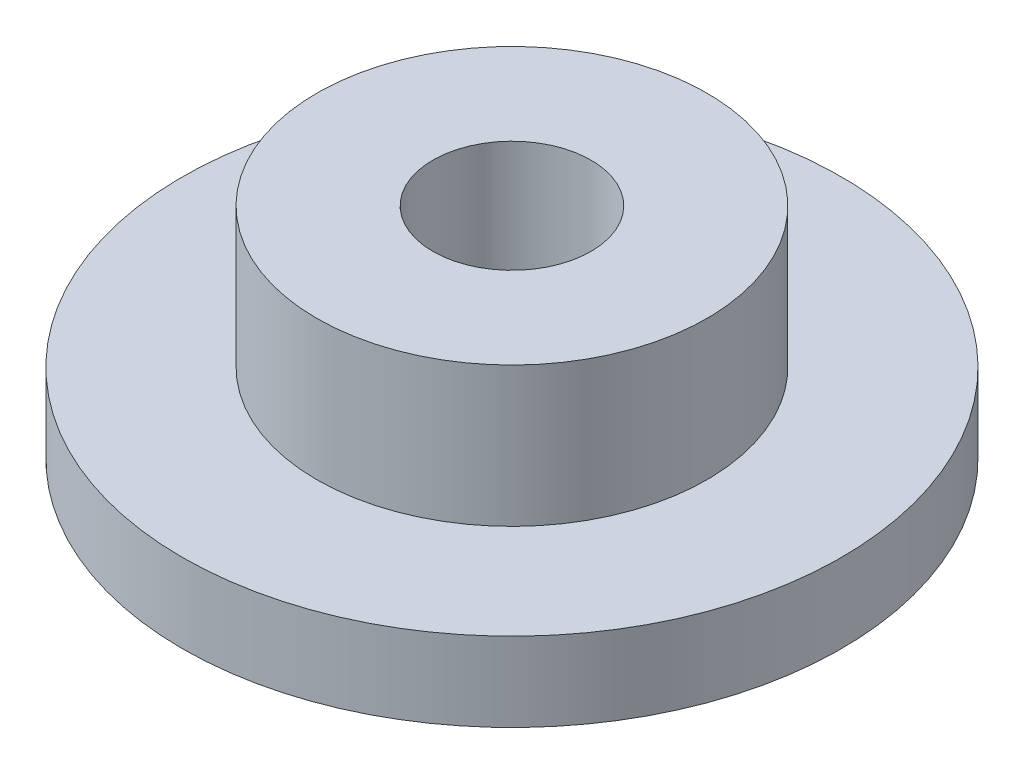
ISO-10303-21;
HEADER;
FILE_DESCRIPTION(('STEP AP214'),'2;1');
FILE_NAME('part.step','',(''),(''),'','','');
FILE_SCHEMA(('AUTOMOTIVE_DESIGN { 1 0 10303 214 1 1 1 1 }'));
ENDSEC;
DATA;
#1=APPLICATION_CONTEXT('core data for automotive mechanical design processes');
#2=APPLICATION_PROTOCOL_DEFINITION('international standard','automotive_design',2000,#1);
#3=PRODUCT_CONTEXT('',#1,'mechanical');
#4=PRODUCT('Part','Part','',(#3));
#5=PRODUCT_RELATED_PRODUCT_CATEGORY('part','',(#4));
#6=PRODUCT_DEFINITION_FORMATION('','',#4);
#7=PRODUCT_DEFINITION_CONTEXT('part definition',#1,'design');
#8=PRODUCT_DEFINITION('design','',#6,#7);
#9=PRODUCT_DEFINITION_SHAPE('','',#8);
#10=(LENGTH_UNIT() NAMED_UNIT(*) SI_UNIT(.MILLI.,.METRE.));
#11=(NAMED_UNIT(*) PLANE_ANGLE_UNIT() SI_UNIT($,.RADIAN.));
#12=(NAMED_UNIT(*) SI_UNIT($,.STERADIAN.) SOLID_ANGLE_UNIT());
#13=UNCERTAINTY_MEASURE_WITH_UNIT(LENGTH_MEASURE(1.E-05),#10,'distance_accuracy_value','');
#14=(GEOMETRIC_REPRESENTATION_CONTEXT(3) GLOBAL_UNCERTAINTY_ASSIGNED_CONTEXT((#13)) GLOBAL_UNIT_ASSIGNED_CONTEXT((#10,
#11,#12)) REPRESENTATION_CONTEXT('',''));
#15=CARTESIAN_POINT('',(0.,0.,0.));
#16=DIRECTION('',(0.,0.,1.));
#17=DIRECTION('',(1.,0.,0.));
#18=AXIS2_PLACEMENT_3D('',#15,#16,#17);
#19=CARTESIAN_POINT('',(0.,3.,0.));
#20=DIRECTION('',(0.,-1.,0.));
#21=DIRECTION('',(0.,0.,-1.));
#22=AXIS2_PLACEMENT_3D('',#19,#20,#21);
#23=CYLINDRICAL_SURFACE('',#22,12.5);
#24=CARTESIAN_POINT('',(0.,3.,0.));
#25=DIRECTION('',(0.,1.,0.));
#26=DIRECTION('',(0.,0.,1.));
#27=AXIS2_PLACEMENT_3D('',#24,#25,#26);
#28=CIRCLE('',#27,12.5);
#29=CARTESIAN_POINT('',(0.,3.,12.5));
#30=VERTEX_POINT('',#29);
#31=EDGE_CURVE('E40',#30,#30,#28,.T.);
#32=ORIENTED_EDGE('',*,*,#31,.F.);
#33=EDGE_LOOP('',(#32));
#34=FACE_BOUND('',#33,.T.);
#35=CARTESIAN_POINT('',(0.,0.,0.));
#36=DIRECTION('',(0.,1.,0.));
#37=DIRECTION('',(0.,0.,1.));
#38=AXIS2_PLACEMENT_3D('',#35,#36,#37);
#39=CIRCLE('',#38,12.5);
#40=CARTESIAN_POINT('',(0.,0.,12.5));
#41=VERTEX_POINT('',#40);
#42=EDGE_CURVE('E36',#41,#41,#39,.T.);
#43=ORIENTED_EDGE('',*,*,#42,.T.);
#44=EDGE_LOOP('',(#43));
#45=FACE_BOUND('',#44,.T.);
#46=ADVANCED_FACE('F33',(#34,#45),#23,.T.);
#47=CARTESIAN_POINT('',(0.,3.,0.));
#48=DIRECTION('',(0.,1.,0.));
#49=DIRECTION('',(0.,0.,1.));
#50=AXIS2_PLACEMENT_3D('',#47,#48,#49);
#51=PLANE('',#50);
#52=CARTESIAN_POINT('',(0.,3.,0.));
#53=DIRECTION('',(0.,1.,0.));
#54=DIRECTION('',(0.,0.,1.));
#55=AXIS2_PLACEMENT_3D('',#52,#53,#54);
#56=CIRCLE('',#55,7.4);
#57=CARTESIAN_POINT('',(0.,3.,7.4));
#58=VERTEX_POINT('',#57);
#59=EDGE_CURVE('E10',#58,#58,#56,.T.);
#60=ORIENTED_EDGE('',*,*,#59,.F.);
#61=EDGE_LOOP('',(#60));
#62=FACE_BOUND('',#61,.T.);
#63=ORIENTED_EDGE('',*,*,#31,.T.);
#64=EDGE_LOOP('',(#63));
#65=FACE_BOUND('',#64,.T.);
#66=ADVANCED_FACE('F72',(#62,#65),#51,.T.);
#67=CARTESIAN_POINT('',(0.,0.,0.));
#68=DIRECTION('',(0.,1.,0.));
#69=DIRECTION('',(0.,0.,1.));
#70=AXIS2_PLACEMENT_3D('',#67,#68,#69);
#71=PLANE('',#70);
#72=CARTESIAN_POINT('',(0.,0.,0.));
#73=DIRECTION('',(0.,1.,0.));
#74=DIRECTION('',(0.,0.,1.));
#75=AXIS2_PLACEMENT_3D('',#72,#73,#74);
#76=CIRCLE('',#75,3.);
#77=CARTESIAN_POINT('',(0.,0.,3.));
#78=VERTEX_POINT('',#77);
#79=EDGE_CURVE('E49',#78,#78,#76,.F.);
#80=ORIENTED_EDGE('',*,*,#79,.F.);
#81=EDGE_LOOP('',(#80));
#82=FACE_BOUND('',#81,.T.);
#83=ORIENTED_EDGE('',*,*,#42,.F.);
#84=EDGE_LOOP('',(#83));
#85=FACE_BOUND('',#84,.T.);
#86=ADVANCED_FACE('F67',(#82,#85),#71,.F.);
#87=CARTESIAN_POINT('',(0.,8.3,0.));
#88=DIRECTION('',(0.,-1.,0.));
#89=DIRECTION('',(0.,0.,-1.));
#90=AXIS2_PLACEMENT_3D('',#87,#88,#89);
#91=CYLINDRICAL_SURFACE('',#90,7.4);
#92=CARTESIAN_POINT('',(0.,8.3,0.));
#93=DIRECTION('',(0.,1.,0.));
#94=DIRECTION('',(0.,0.,1.));
#95=AXIS2_PLACEMENT_3D('',#92,#93,#94);
#96=CIRCLE('',#95,7.4);
#97=CARTESIAN_POINT('',(0.,8.3,7.4));
#98=VERTEX_POINT('',#97);
#99=EDGE_CURVE('E46',#98,#98,#96,.T.);
#100=ORIENTED_EDGE('',*,*,#99,.F.);
#101=EDGE_LOOP('',(#100));
#102=FACE_BOUND('',#101,.T.);
#103=ORIENTED_EDGE('',*,*,#59,.T.);
#104=EDGE_LOOP('',(#103));
#105=FACE_BOUND('',#104,.T.);
#106=ADVANCED_FACE('F62',(#102,#105),#91,.T.);
#107=CARTESIAN_POINT('',(0.,8.3,0.));
#108=DIRECTION('',(0.,1.,0.));
#109=DIRECTION('',(0.,0.,1.));
#110=AXIS2_PLACEMENT_3D('',#107,#108,#109);
#111=PLANE('',#110);
#112=CARTESIAN_POINT('',(0.,8.3,0.));
#113=DIRECTION('',(0.,1.,0.));
#114=DIRECTION('',(0.,0.,1.));
#115=AXIS2_PLACEMENT_3D('',#112,#113,#114);
#116=CIRCLE('',#115,3.);
#117=CARTESIAN_POINT('',(0.,8.3,3.));
#118=VERTEX_POINT('',#117);
#119=EDGE_CURVE('E52',#118,#118,#116,.T.);
#120=ORIENTED_EDGE('',*,*,#119,.F.);
#121=EDGE_LOOP('',(#120));
#122=FACE_BOUND('',#121,.T.);
#123=ORIENTED_EDGE('',*,*,#99,.T.);
#124=EDGE_LOOP('',(#123));
#125=FACE_BOUND('',#124,.T.);
#126=ADVANCED_FACE('F59',(#122,#125),#111,.T.);
#127=CARTESIAN_POINT('',(0.,-0.000999999999999265,0.));
#128=DIRECTION('',(0.,1.,0.));
#129=DIRECTION('',(0.,0.,1.));
#130=AXIS2_PLACEMENT_3D('',#127,#128,#129);
#131=CYLINDRICAL_SURFACE('',#130,3.);
#132=ORIENTED_EDGE('',*,*,#119,.T.);
#133=EDGE_LOOP('',(#132));
#134=FACE_BOUND('',#133,.T.);
#135=ORIENTED_EDGE('',*,*,#79,.T.);
#136=EDGE_LOOP('',(#135));
#137=FACE_BOUND('',#136,.T.);
#138=ADVANCED_FACE('F56',(#134,#137),#131,.F.);
#139=CLOSED_SHELL('',(#46,#66,#86,#106,#126,#138));
#140=MANIFOLD_SOLID_BREP('B2',#139);
#141=ADVANCED_BREP_SHAPE_REPRESENTATION('',(#18,#140),#14);
#142=SHAPE_DEFINITION_REPRESENTATION(#9,#141);
ENDSEC;
END-ISO-10303-21;
